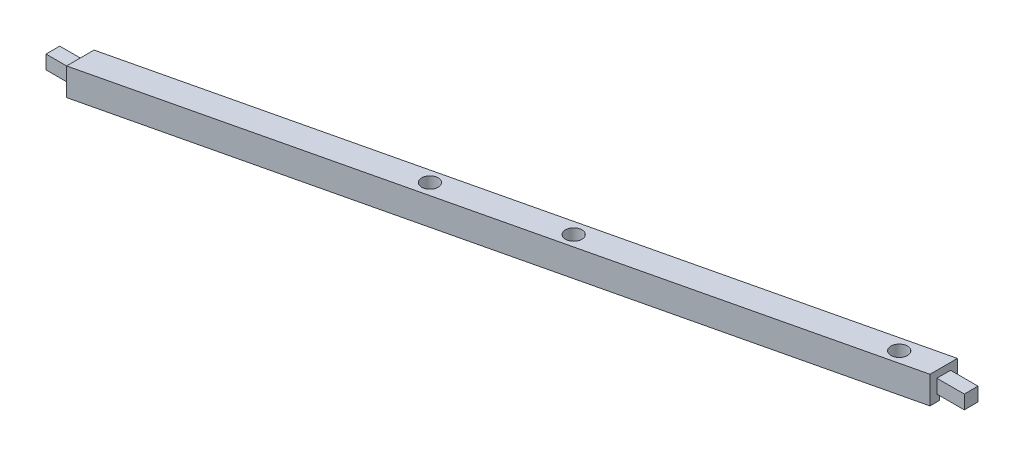
ISO-10303-21;
HEADER;
FILE_DESCRIPTION(('STEP AP214'),'2;1');
FILE_NAME('part.step','',(''),(''),'','','');
FILE_SCHEMA(('AUTOMOTIVE_DESIGN { 1 0 10303 214 1 1 1 1 }'));
ENDSEC;
DATA;
#1=APPLICATION_CONTEXT('core data for automotive mechanical design processes');
#2=APPLICATION_PROTOCOL_DEFINITION('international standard','automotive_design',2000,#1);
#3=PRODUCT_CONTEXT('',#1,'mechanical');
#4=PRODUCT('Part','Part','',(#3));
#5=PRODUCT_RELATED_PRODUCT_CATEGORY('part','',(#4));
#6=PRODUCT_DEFINITION_FORMATION('','',#4);
#7=PRODUCT_DEFINITION_CONTEXT('part definition',#1,'design');
#8=PRODUCT_DEFINITION('design','',#6,#7);
#9=PRODUCT_DEFINITION_SHAPE('','',#8);
#10=(LENGTH_UNIT() NAMED_UNIT(*) SI_UNIT(.MILLI.,.METRE.));
#11=(NAMED_UNIT(*) PLANE_ANGLE_UNIT() SI_UNIT($,.RADIAN.));
#12=(NAMED_UNIT(*) SI_UNIT($,.STERADIAN.) SOLID_ANGLE_UNIT());
#13=UNCERTAINTY_MEASURE_WITH_UNIT(LENGTH_MEASURE(1.E-05),#10,'distance_accuracy_value','');
#14=(GEOMETRIC_REPRESENTATION_CONTEXT(3) GLOBAL_UNCERTAINTY_ASSIGNED_CONTEXT((#13)) GLOBAL_UNIT_ASSIGNED_CONTEXT((#10,
#11,#12)) REPRESENTATION_CONTEXT('',''));
#15=CARTESIAN_POINT('',(0.,0.,0.));
#16=DIRECTION('',(0.,0.,1.));
#17=DIRECTION('',(1.,0.,0.));
#18=AXIS2_PLACEMENT_3D('',#15,#16,#17);
#19=CARTESIAN_POINT('',(0.,0.,0.));
#20=DIRECTION('',(0.,1.,0.));
#21=DIRECTION('',(0.,0.,1.));
#22=AXIS2_PLACEMENT_3D('',#19,#20,#21);
#23=PLANE('',#22);
#24=DIRECTION('',(0.,0.,-1.));
#25=VECTOR('',#24,1.);
#26=CARTESIAN_POINT('',(0.,0.,0.));
#27=LINE('',#26,#25);
#28=CARTESIAN_POINT('',(0.,0.,0.));
#29=VERTEX_POINT('',#28);
#30=CARTESIAN_POINT('',(0.,0.,-1.75));
#31=VERTEX_POINT('',#30);
#32=EDGE_CURVE('E425',#29,#31,#27,.T.);
#33=ORIENTED_EDGE('',*,*,#32,.T.);
#34=DIRECTION('',(-0.973336888209918,0.,0.22938025645167));
#35=VECTOR('',#34,1.);
#36=CARTESIAN_POINT('',(0.,0.,-1.75));
#37=LINE('',#36,#35);
#38=CARTESIAN_POINT('',(50.4456686779814,0.,-13.6382172846775));
#39=VERTEX_POINT('',#38);
#40=EDGE_CURVE('E265',#39,#31,#37,.T.);
#41=ORIENTED_EDGE('',*,*,#40,.F.);
#42=CARTESIAN_POINT('',(51.5,0.,-14.7051687659598));
#43=DIRECTION('',(0.,-1.,0.));
#44=DIRECTION('',(0.,0.,-1.));
#45=AXIS2_PLACEMENT_3D('',#42,#43,#44);
#46=CIRCLE('',#45,1.5);
#47=CARTESIAN_POINT('',(52.9198076766668,0.,-14.2212822490181));
#48=VERTEX_POINT('',#47);
#49=EDGE_CURVE('E320',#48,#39,#46,.T.);
#50=ORIENTED_EDGE('',*,*,#49,.F.);
#51=CARTESIAN_POINT('',(71.6426769276183,0.,-18.6335845076869));
#52=VERTEX_POINT('',#51);
#53=EDGE_CURVE('E467',#52,#48,#37,.T.);
#54=ORIENTED_EDGE('',*,*,#53,.F.);
#55=CARTESIAN_POINT('',(72.8,0.,-19.5878398750457));
#56=DIRECTION('',(0.,-1.,0.));
#57=DIRECTION('',(0.,0.,-1.));
#58=AXIS2_PLACEMENT_3D('',#55,#56,#57);
#59=CIRCLE('',#58,1.5);
#60=CARTESIAN_POINT('',(74.2616395128278,0.,-19.250779146778));
#61=VERTEX_POINT('',#60);
#62=EDGE_CURVE('E327',#61,#52,#59,.T.);
#63=ORIENTED_EDGE('',*,*,#62,.F.);
#64=CARTESIAN_POINT('',(119.642676927618,0.,-29.945446251599));
#65=VERTEX_POINT('',#64);
#66=EDGE_CURVE('E263',#65,#61,#37,.T.);
#67=ORIENTED_EDGE('',*,*,#66,.F.);
#68=CARTESIAN_POINT('',(120.8,0.,-30.8997016189577));
#69=DIRECTION('',(0.,-1.,0.));
#70=DIRECTION('',(0.,0.,-1.));
#71=AXIS2_PLACEMENT_3D('',#68,#69,#70);
#72=CIRCLE('',#71,1.5);
#73=CARTESIAN_POINT('',(122.261639512828,0.,-30.56264089069));
#74=VERTEX_POINT('',#73);
#75=EDGE_CURVE('E334',#74,#65,#72,.T.);
#76=ORIENTED_EDGE('',*,*,#75,.F.);
#77=CARTESIAN_POINT('',(127.3,0.,-31.75));
#78=VERTEX_POINT('',#77);
#79=EDGE_CURVE('E260',#78,#74,#37,.T.);
#80=ORIENTED_EDGE('',*,*,#79,.F.);
#81=DIRECTION('',(0.,0.,-1.));
#82=VECTOR('',#81,1.);
#83=CARTESIAN_POINT('',(127.3,0.,0.));
#84=LINE('',#83,#82);
#85=CARTESIAN_POINT('',(127.3,0.,-30.));
#86=VERTEX_POINT('',#85);
#87=EDGE_CURVE('E418',#86,#78,#84,.T.);
#88=ORIENTED_EDGE('',*,*,#87,.F.);
#89=DIRECTION('',(0.973336888209918,0.,-0.22938025645167));
#90=VECTOR('',#89,1.);
#91=CARTESIAN_POINT('',(0.,0.,0.));
#92=LINE('',#91,#90);
#93=EDGE_CURVE('E410',#29,#86,#92,.T.);
#94=ORIENTED_EDGE('',*,*,#93,.F.);
#95=EDGE_LOOP('',(#33,#41,#50,#54,#63,#67,#76,#80,#88,#94));
#96=FACE_BOUND('',#95,.T.);
#97=ADVANCED_FACE('F35',(#96),#23,.F.);
#98=CARTESIAN_POINT('',(127.3,5.,0.));
#99=DIRECTION('',(-1.,0.,0.));
#100=DIRECTION('',(0.,0.,1.));
#101=AXIS2_PLACEMENT_3D('',#98,#99,#100);
#102=PLANE('',#101);
#103=ORIENTED_EDGE('',*,*,#87,.T.);
#104=DIRECTION('',(0.,-1.,0.));
#105=VECTOR('',#104,1.);
#106=CARTESIAN_POINT('',(127.3,2.,-31.75));
#107=LINE('',#106,#105);
#108=CARTESIAN_POINT('',(127.3,1.25,-31.75));
#109=VERTEX_POINT('',#108);
#110=EDGE_CURVE('E280',#109,#78,#107,.T.);
#111=ORIENTED_EDGE('',*,*,#110,.F.);
#112=DIRECTION('',(0.,0.,-1.));
#113=VECTOR('',#112,1.);
#114=CARTESIAN_POINT('',(127.3,1.25,-31.25));
#115=LINE('',#114,#113);
#116=CARTESIAN_POINT('',(127.3,1.25,-31.25));
#117=VERTEX_POINT('',#116);
#118=EDGE_CURVE('E385',#117,#109,#115,.T.);
#119=ORIENTED_EDGE('',*,*,#118,.F.);
#120=DIRECTION('',(0.,-1.,0.));
#121=VECTOR('',#120,1.);
#122=CARTESIAN_POINT('',(127.3,3.75,-31.25));
#123=LINE('',#122,#121);
#124=CARTESIAN_POINT('',(127.3,3.75,-31.25));
#125=VERTEX_POINT('',#124);
#126=EDGE_CURVE('E370',#125,#117,#123,.T.);
#127=ORIENTED_EDGE('',*,*,#126,.F.);
#128=DIRECTION('',(0.,0.,1.));
#129=VECTOR('',#128,1.);
#130=CARTESIAN_POINT('',(127.3,3.75,-31.25));
#131=LINE('',#130,#129);
#132=CARTESIAN_POINT('',(127.3,3.75,-33.75));
#133=VERTEX_POINT('',#132);
#134=EDGE_CURVE('E375',#133,#125,#131,.T.);
#135=ORIENTED_EDGE('',*,*,#134,.F.);
#136=DIRECTION('',(0.,1.,0.));
#137=VECTOR('',#136,1.);
#138=CARTESIAN_POINT('',(127.3,3.75,-33.75));
#139=LINE('',#138,#137);
#140=CARTESIAN_POINT('',(127.3,1.25,-33.75));
#141=VERTEX_POINT('',#140);
#142=EDGE_CURVE('E388',#141,#133,#139,.T.);
#143=ORIENTED_EDGE('',*,*,#142,.F.);
#144=CARTESIAN_POINT('',(127.3,1.25,-33.25));
#145=VERTEX_POINT('',#144);
#146=EDGE_CURVE('E384',#145,#141,#115,.T.);
#147=ORIENTED_EDGE('',*,*,#146,.F.);
#148=DIRECTION('',(0.,-1.,0.));
#149=VECTOR('',#148,1.);
#150=CARTESIAN_POINT('',(127.3,2.,-33.25));
#151=LINE('',#150,#149);
#152=CARTESIAN_POINT('',(127.3,0.,-33.25));
#153=VERTEX_POINT('',#152);
#154=EDGE_CURVE('E243',#145,#153,#151,.T.);
#155=ORIENTED_EDGE('',*,*,#154,.T.);
#156=CARTESIAN_POINT('',(127.3,0.,-35.));
#157=VERTEX_POINT('',#156);
#158=EDGE_CURVE('E405',#153,#157,#84,.T.);
#159=ORIENTED_EDGE('',*,*,#158,.T.);
#160=DIRECTION('',(0.,-1.,0.));
#161=VECTOR('',#160,1.);
#162=CARTESIAN_POINT('',(127.3,5.,-35.));
#163=LINE('',#162,#161);
#164=CARTESIAN_POINT('',(127.3,5.,-35.));
#165=VERTEX_POINT('',#164);
#166=EDGE_CURVE('E436',#165,#157,#163,.T.);
#167=ORIENTED_EDGE('',*,*,#166,.F.);
#168=DIRECTION('',(0.,0.,-1.));
#169=VECTOR('',#168,1.);
#170=CARTESIAN_POINT('',(127.3,5.,0.));
#171=LINE('',#170,#169);
#172=CARTESIAN_POINT('',(127.3,5.,-30.));
#173=VERTEX_POINT('',#172);
#174=EDGE_CURVE('E406',#173,#165,#171,.T.);
#175=ORIENTED_EDGE('',*,*,#174,.F.);
#176=DIRECTION('',(0.,-1.,0.));
#177=VECTOR('',#176,1.);
#178=CARTESIAN_POINT('',(127.3,5.,-30.));
#179=LINE('',#178,#177);
#180=EDGE_CURVE('E417',#173,#86,#179,.T.);
#181=ORIENTED_EDGE('',*,*,#180,.T.);
#182=EDGE_LOOP('',(#103,#111,#119,#127,#135,#143,#147,#155,#159,#167,#175,#181));
#183=FACE_BOUND('',#182,.T.);
#184=ADVANCED_FACE('F37',(#183),#102,.F.);
#185=CARTESIAN_POINT('',(-1.11632132515731,5.,-4.73692348975083));
#186=DIRECTION('',(0.22938025645167,0.,0.973336888209918));
#187=DIRECTION('',(0.973336888209918,0.,-0.22938025645167));
#188=AXIS2_PLACEMENT_3D('',#185,#186,#187);
#189=PLANE('',#188);
#190=DIRECTION('',(-0.973336888209918,0.,0.22938025645167));
#191=VECTOR('',#190,1.);
#192=CARTESIAN_POINT('',(-1.11632132515731,0.,-4.73692348975083));
#193=LINE('',#192,#191);
#194=CARTESIAN_POINT('',(0.,0.,-5.));
#195=VERTEX_POINT('',#194);
#196=EDGE_CURVE('E421',#157,#195,#193,.T.);
#197=ORIENTED_EDGE('',*,*,#196,.T.);
#198=DIRECTION('',(0.,-1.,0.));
#199=VECTOR('',#198,1.);
#200=CARTESIAN_POINT('',(0.,5.,-5.));
#201=LINE('',#200,#199);
#202=CARTESIAN_POINT('',(0.,5.,-5.));
#203=VERTEX_POINT('',#202);
#204=EDGE_CURVE('E433',#203,#195,#201,.T.);
#205=ORIENTED_EDGE('',*,*,#204,.F.);
#206=DIRECTION('',(-0.973336888209918,0.,0.22938025645167));
#207=VECTOR('',#206,1.);
#208=CARTESIAN_POINT('',(-1.11632132515731,5.,-4.73692348975083));
#209=LINE('',#208,#207);
#210=EDGE_CURVE('E409',#165,#203,#209,.T.);
#211=ORIENTED_EDGE('',*,*,#210,.F.);
#212=ORIENTED_EDGE('',*,*,#166,.T.);
#213=EDGE_LOOP('',(#197,#205,#211,#212));
#214=FACE_BOUND('',#213,.T.);
#215=ADVANCED_FACE('F496',(#214),#189,.F.);
#216=CARTESIAN_POINT('',(0.,5.,0.));
#217=DIRECTION('',(-1.,0.,0.));
#218=DIRECTION('',(0.,0.,1.));
#219=AXIS2_PLACEMENT_3D('',#216,#217,#218);
#220=PLANE('',#219);
#221=DIRECTION('',(0.,-1.,0.));
#222=VECTOR('',#221,1.);
#223=CARTESIAN_POINT('',(0.,2.,-1.75));
#224=LINE('',#223,#222);
#225=CARTESIAN_POINT('',(0.,1.25,-1.75));
#226=VERTEX_POINT('',#225);
#227=EDGE_CURVE('E276',#226,#31,#224,.T.);
#228=ORIENTED_EDGE('',*,*,#227,.T.);
#229=ORIENTED_EDGE('',*,*,#32,.F.);
#230=DIRECTION('',(0.,-1.,0.));
#231=VECTOR('',#230,1.);
#232=CARTESIAN_POINT('',(0.,5.,0.));
#233=LINE('',#232,#231);
#234=CARTESIAN_POINT('',(0.,5.,0.));
#235=VERTEX_POINT('',#234);
#236=EDGE_CURVE('E431',#235,#29,#233,.T.);
#237=ORIENTED_EDGE('',*,*,#236,.F.);
#238=DIRECTION('',(0.,0.,-1.));
#239=VECTOR('',#238,1.);
#240=CARTESIAN_POINT('',(0.,5.,0.));
#241=LINE('',#240,#239);
#242=EDGE_CURVE('E412',#235,#203,#241,.T.);
#243=ORIENTED_EDGE('',*,*,#242,.T.);
#244=ORIENTED_EDGE('',*,*,#204,.T.);
#245=CARTESIAN_POINT('',(0.,0.,-3.25));
#246=VERTEX_POINT('',#245);
#247=EDGE_CURVE('E424',#246,#195,#27,.T.);
#248=ORIENTED_EDGE('',*,*,#247,.F.);
#249=DIRECTION('',(0.,-1.,0.));
#250=VECTOR('',#249,1.);
#251=CARTESIAN_POINT('',(0.,2.,-3.25));
#252=LINE('',#251,#250);
#253=CARTESIAN_POINT('',(0.,1.25,-3.25));
#254=VERTEX_POINT('',#253);
#255=EDGE_CURVE('E244',#254,#246,#252,.T.);
#256=ORIENTED_EDGE('',*,*,#255,.F.);
#257=DIRECTION('',(0.,0.,1.));
#258=VECTOR('',#257,1.);
#259=CARTESIAN_POINT('',(0.,1.25,-3.75));
#260=LINE('',#259,#258);
#261=CARTESIAN_POINT('',(0.,1.25,-3.75));
#262=VERTEX_POINT('',#261);
#263=EDGE_CURVE('E351',#262,#254,#260,.T.);
#264=ORIENTED_EDGE('',*,*,#263,.F.);
#265=DIRECTION('',(0.,-1.,0.));
#266=VECTOR('',#265,1.);
#267=CARTESIAN_POINT('',(0.,3.75,-3.75));
#268=LINE('',#267,#266);
#269=CARTESIAN_POINT('',(0.,3.75,-3.75));
#270=VERTEX_POINT('',#269);
#271=EDGE_CURVE('E319',#270,#262,#268,.T.);
#272=ORIENTED_EDGE('',*,*,#271,.F.);
#273=DIRECTION('',(0.,0.,-1.));
#274=VECTOR('',#273,1.);
#275=CARTESIAN_POINT('',(0.,3.75,-3.75));
#276=LINE('',#275,#274);
#277=CARTESIAN_POINT('',(0.,3.75,-1.25));
#278=VERTEX_POINT('',#277);
#279=EDGE_CURVE('E341',#278,#270,#276,.T.);
#280=ORIENTED_EDGE('',*,*,#279,.F.);
#281=DIRECTION('',(0.,1.,0.));
#282=VECTOR('',#281,1.);
#283=CARTESIAN_POINT('',(0.,3.75,-1.25));
#284=LINE('',#283,#282);
#285=CARTESIAN_POINT('',(0.,1.25,-1.25));
#286=VERTEX_POINT('',#285);
#287=EDGE_CURVE('E354',#286,#278,#284,.T.);
#288=ORIENTED_EDGE('',*,*,#287,.F.);
#289=EDGE_CURVE('E350',#226,#286,#260,.T.);
#290=ORIENTED_EDGE('',*,*,#289,.F.);
#291=EDGE_LOOP('',(#228,#229,#237,#243,#244,#248,#256,#264,#272,#280,#288,#290));
#292=FACE_BOUND('',#291,.T.);
#293=ADVANCED_FACE('F512',(#292),#220,.T.);
#294=CARTESIAN_POINT('',(0.,5.,0.));
#295=DIRECTION('',(-0.22938025645167,0.,-0.973336888209918));
#296=DIRECTION('',(-0.973336888209918,0.,0.22938025645167));
#297=AXIS2_PLACEMENT_3D('',#294,#295,#296);
#298=PLANE('',#297);
#299=ORIENTED_EDGE('',*,*,#93,.T.);
#300=ORIENTED_EDGE('',*,*,#180,.F.);
#301=DIRECTION('',(0.973336888209918,0.,-0.22938025645167));
#302=VECTOR('',#301,1.);
#303=CARTESIAN_POINT('',(0.,5.,0.));
#304=LINE('',#303,#302);
#305=EDGE_CURVE('E415',#235,#173,#304,.T.);
#306=ORIENTED_EDGE('',*,*,#305,.F.);
#307=ORIENTED_EDGE('',*,*,#236,.T.);
#308=EDGE_LOOP('',(#299,#300,#306,#307));
#309=FACE_BOUND('',#308,.T.);
#310=ADVANCED_FACE('F505',(#309),#298,.F.);
#311=CARTESIAN_POINT('',(0.,5.,0.));
#312=DIRECTION('',(0.,1.,0.));
#313=DIRECTION('',(0.,0.,1.));
#314=AXIS2_PLACEMENT_3D('',#311,#312,#313);
#315=PLANE('',#314);
#316=CARTESIAN_POINT('',(51.5,5.,-14.7051687659598));
#317=DIRECTION('',(0.,-1.,0.));
#318=DIRECTION('',(0.,0.,-1.));
#319=AXIS2_PLACEMENT_3D('',#316,#317,#318);
#320=CIRCLE('',#319,1.5);
#321=CARTESIAN_POINT('',(51.5,5.,-16.2051687659598));
#322=VERTEX_POINT('',#321);
#323=EDGE_CURVE('E316',#322,#322,#320,.T.);
#324=ORIENTED_EDGE('',*,*,#323,.T.);
#325=EDGE_LOOP('',(#324));
#326=FACE_BOUND('',#325,.T.);
#327=CARTESIAN_POINT('',(72.8,5.,-19.5878398750457));
#328=DIRECTION('',(0.,-1.,0.));
#329=DIRECTION('',(0.,0.,-1.));
#330=AXIS2_PLACEMENT_3D('',#327,#328,#329);
#331=CIRCLE('',#330,1.5);
#332=CARTESIAN_POINT('',(72.8,5.,-21.0878398750457));
#333=VERTEX_POINT('',#332);
#334=EDGE_CURVE('E324',#333,#333,#331,.T.);
#335=ORIENTED_EDGE('',*,*,#334,.T.);
#336=EDGE_LOOP('',(#335));
#337=FACE_BOUND('',#336,.T.);
#338=CARTESIAN_POINT('',(120.8,5.,-30.8997016189577));
#339=DIRECTION('',(0.,-1.,0.));
#340=DIRECTION('',(0.,0.,-1.));
#341=AXIS2_PLACEMENT_3D('',#338,#339,#340);
#342=CIRCLE('',#341,1.5);
#343=CARTESIAN_POINT('',(120.8,5.,-32.3997016189577));
#344=VERTEX_POINT('',#343);
#345=EDGE_CURVE('E331',#344,#344,#342,.T.);
#346=ORIENTED_EDGE('',*,*,#345,.T.);
#347=EDGE_LOOP('',(#346));
#348=FACE_BOUND('',#347,.T.);
#349=ORIENTED_EDGE('',*,*,#174,.T.);
#350=ORIENTED_EDGE('',*,*,#210,.T.);
#351=ORIENTED_EDGE('',*,*,#242,.F.);
#352=ORIENTED_EDGE('',*,*,#305,.T.);
#353=EDGE_LOOP('',(#349,#350,#351,#352));
#354=FACE_BOUND('',#353,.T.);
#355=ADVANCED_FACE('F501',(#326,#337,#348,#354),#315,.T.);
#356=ORIENTED_EDGE('',*,*,#158,.F.);
#357=DIRECTION('',(0.973336888209918,0.,-0.22938025645167));
#358=VECTOR('',#357,1.);
#359=CARTESIAN_POINT('',(0.,0.,-3.25));
#360=LINE('',#359,#358);
#361=CARTESIAN_POINT('',(121.854331322019,0.,-31.96665310024));
#362=VERTEX_POINT('',#361);
#363=EDGE_CURVE('E271',#362,#153,#360,.T.);
#364=ORIENTED_EDGE('',*,*,#363,.F.);
#365=CARTESIAN_POINT('',(119.380192323333,0.,-31.3835881358994));
#366=VERTEX_POINT('',#365);
#367=EDGE_CURVE('E315',#366,#362,#72,.T.);
#368=ORIENTED_EDGE('',*,*,#367,.F.);
#369=CARTESIAN_POINT('',(73.8543313220186,0.,-20.654791356328));
#370=VERTEX_POINT('',#369);
#371=EDGE_CURVE('E478',#370,#366,#360,.T.);
#372=ORIENTED_EDGE('',*,*,#371,.F.);
#373=CARTESIAN_POINT('',(71.3801923233332,0.,-20.0717263919874));
#374=VERTEX_POINT('',#373);
#375=EDGE_CURVE('E328',#374,#370,#59,.T.);
#376=ORIENTED_EDGE('',*,*,#375,.F.);
#377=CARTESIAN_POINT('',(52.6573230723817,0.,-15.6594241333185));
#378=VERTEX_POINT('',#377);
#379=EDGE_CURVE('E270',#378,#374,#360,.T.);
#380=ORIENTED_EDGE('',*,*,#379,.F.);
#381=CARTESIAN_POINT('',(50.0383604871721,0.,-15.0422294942275));
#382=VERTEX_POINT('',#381);
#383=EDGE_CURVE('E321',#382,#378,#46,.T.);
#384=ORIENTED_EDGE('',*,*,#383,.F.);
#385=EDGE_CURVE('E269',#246,#382,#360,.T.);
#386=ORIENTED_EDGE('',*,*,#385,.F.);
#387=ORIENTED_EDGE('',*,*,#247,.T.);
#388=ORIENTED_EDGE('',*,*,#196,.F.);
#389=EDGE_LOOP('',(#356,#364,#368,#372,#376,#380,#384,#386,#387,#388));
#390=FACE_BOUND('',#389,.T.);
#391=ADVANCED_FACE('F475',(#390),#23,.F.);
#392=CARTESIAN_POINT('',(132.3,3.75,-31.25));
#393=DIRECTION('',(0.,0.,-1.));
#394=DIRECTION('',(-1.,0.,0.));
#395=AXIS2_PLACEMENT_3D('',#392,#393,#394);
#396=PLANE('',#395);
#397=ORIENTED_EDGE('',*,*,#126,.T.);
#398=DIRECTION('',(-1.,0.,0.));
#399=VECTOR('',#398,1.);
#400=CARTESIAN_POINT('',(132.3,1.25,-31.25));
#401=LINE('',#400,#399);
#402=CARTESIAN_POINT('',(132.3,1.25,-31.25));
#403=VERTEX_POINT('',#402);
#404=EDGE_CURVE('E402',#403,#117,#401,.T.);
#405=ORIENTED_EDGE('',*,*,#404,.F.);
#406=DIRECTION('',(0.,-1.,0.));
#407=VECTOR('',#406,1.);
#408=CARTESIAN_POINT('',(132.3,3.75,-31.25));
#409=LINE('',#408,#407);
#410=CARTESIAN_POINT('',(132.3,3.75,-31.25));
#411=VERTEX_POINT('',#410);
#412=EDGE_CURVE('E371',#411,#403,#409,.T.);
#413=ORIENTED_EDGE('',*,*,#412,.F.);
#414=DIRECTION('',(-1.,0.,0.));
#415=VECTOR('',#414,1.);
#416=CARTESIAN_POINT('',(132.3,3.75,-31.25));
#417=LINE('',#416,#415);
#418=EDGE_CURVE('E381',#411,#125,#417,.T.);
#419=ORIENTED_EDGE('',*,*,#418,.T.);
#420=EDGE_LOOP('',(#397,#405,#413,#419));
#421=FACE_BOUND('',#420,.T.);
#422=ADVANCED_FACE('F541',(#421),#396,.F.);
#423=CARTESIAN_POINT('',(132.3,1.25,-31.25));
#424=DIRECTION('',(0.,1.,0.));
#425=DIRECTION('',(0.,0.,1.));
#426=AXIS2_PLACEMENT_3D('',#423,#424,#425);
#427=PLANE('',#426);
#428=ORIENTED_EDGE('',*,*,#118,.T.);
#429=EDGE_CURVE('E389',#109,#145,#115,.T.);
#430=ORIENTED_EDGE('',*,*,#429,.T.);
#431=ORIENTED_EDGE('',*,*,#146,.T.);
#432=DIRECTION('',(-1.,0.,0.));
#433=VECTOR('',#432,1.);
#434=CARTESIAN_POINT('',(132.3,1.25,-33.75));
#435=LINE('',#434,#433);
#436=CARTESIAN_POINT('',(132.3,1.25,-33.75));
#437=VERTEX_POINT('',#436);
#438=EDGE_CURVE('E399',#437,#141,#435,.T.);
#439=ORIENTED_EDGE('',*,*,#438,.F.);
#440=DIRECTION('',(0.,0.,-1.));
#441=VECTOR('',#440,1.);
#442=CARTESIAN_POINT('',(132.3,1.25,-31.25));
#443=LINE('',#442,#441);
#444=EDGE_CURVE('E374',#403,#437,#443,.T.);
#445=ORIENTED_EDGE('',*,*,#444,.F.);
#446=ORIENTED_EDGE('',*,*,#404,.T.);
#447=EDGE_LOOP('',(#428,#430,#431,#439,#445,#446));
#448=FACE_BOUND('',#447,.T.);
#449=ADVANCED_FACE('F536',(#448),#427,.F.);
#450=CARTESIAN_POINT('',(132.3,3.75,-33.75));
#451=DIRECTION('',(0.,0.,1.));
#452=DIRECTION('',(1.,0.,0.));
#453=AXIS2_PLACEMENT_3D('',#450,#451,#452);
#454=PLANE('',#453);
#455=ORIENTED_EDGE('',*,*,#142,.T.);
#456=DIRECTION('',(-1.,0.,0.));
#457=VECTOR('',#456,1.);
#458=CARTESIAN_POINT('',(132.3,3.75,-33.75));
#459=LINE('',#458,#457);
#460=CARTESIAN_POINT('',(132.3,3.75,-33.75));
#461=VERTEX_POINT('',#460);
#462=EDGE_CURVE('E396',#461,#133,#459,.T.);
#463=ORIENTED_EDGE('',*,*,#462,.F.);
#464=DIRECTION('',(0.,1.,0.));
#465=VECTOR('',#464,1.);
#466=CARTESIAN_POINT('',(132.3,3.75,-33.75));
#467=LINE('',#466,#465);
#468=EDGE_CURVE('E377',#437,#461,#467,.T.);
#469=ORIENTED_EDGE('',*,*,#468,.F.);
#470=ORIENTED_EDGE('',*,*,#438,.T.);
#471=EDGE_LOOP('',(#455,#463,#469,#470));
#472=FACE_BOUND('',#471,.T.);
#473=ADVANCED_FACE('F549',(#472),#454,.F.);
#474=CARTESIAN_POINT('',(132.3,3.75,-31.25));
#475=DIRECTION('',(0.,-1.,0.));
#476=DIRECTION('',(0.,0.,-1.));
#477=AXIS2_PLACEMENT_3D('',#474,#475,#476);
#478=PLANE('',#477);
#479=ORIENTED_EDGE('',*,*,#134,.T.);
#480=ORIENTED_EDGE('',*,*,#418,.F.);
#481=DIRECTION('',(0.,0.,1.));
#482=VECTOR('',#481,1.);
#483=CARTESIAN_POINT('',(132.3,3.75,-31.25));
#484=LINE('',#483,#482);
#485=EDGE_CURVE('E379',#461,#411,#484,.T.);
#486=ORIENTED_EDGE('',*,*,#485,.F.);
#487=ORIENTED_EDGE('',*,*,#462,.T.);
#488=EDGE_LOOP('',(#479,#480,#486,#487));
#489=FACE_BOUND('',#488,.T.);
#490=ADVANCED_FACE('F544',(#489),#478,.F.);
#491=CARTESIAN_POINT('',(132.3,0.,0.));
#492=DIRECTION('',(1.,0.,0.));
#493=DIRECTION('',(0.,0.,-1.));
#494=AXIS2_PLACEMENT_3D('',#491,#492,#493);
#495=PLANE('',#494);
#496=ORIENTED_EDGE('',*,*,#412,.T.);
#497=ORIENTED_EDGE('',*,*,#444,.T.);
#498=ORIENTED_EDGE('',*,*,#468,.T.);
#499=ORIENTED_EDGE('',*,*,#485,.T.);
#500=EDGE_LOOP('',(#496,#497,#498,#499));
#501=FACE_BOUND('',#500,.T.);
#502=ADVANCED_FACE('F551',(#501),#495,.T.);
#503=CARTESIAN_POINT('',(-5.,3.75,-3.75));
#504=DIRECTION('',(0.,0.,1.));
#505=DIRECTION('',(0.,-1.,0.));
#506=AXIS2_PLACEMENT_3D('',#503,#504,#505);
#507=PLANE('',#506);
#508=ORIENTED_EDGE('',*,*,#271,.T.);
#509=DIRECTION('',(1.,0.,0.));
#510=VECTOR('',#509,1.);
#511=CARTESIAN_POINT('',(-5.,1.25,-3.75));
#512=LINE('',#511,#510);
#513=CARTESIAN_POINT('',(-5.,1.25,-3.75));
#514=VERTEX_POINT('',#513);
#515=EDGE_CURVE('E367',#514,#262,#512,.T.);
#516=ORIENTED_EDGE('',*,*,#515,.F.);
#517=DIRECTION('',(0.,-1.,0.));
#518=VECTOR('',#517,1.);
#519=CARTESIAN_POINT('',(-5.,3.75,-3.75));
#520=LINE('',#519,#518);
#521=CARTESIAN_POINT('',(-5.,3.75,-3.75));
#522=VERTEX_POINT('',#521);
#523=EDGE_CURVE('E337',#522,#514,#520,.T.);
#524=ORIENTED_EDGE('',*,*,#523,.F.);
#525=DIRECTION('',(1.,0.,0.));
#526=VECTOR('',#525,1.);
#527=CARTESIAN_POINT('',(-5.,3.75,-3.75));
#528=LINE('',#527,#526);
#529=EDGE_CURVE('E347',#522,#270,#528,.T.);
#530=ORIENTED_EDGE('',*,*,#529,.T.);
#531=EDGE_LOOP('',(#508,#516,#524,#530));
#532=FACE_BOUND('',#531,.T.);
#533=ADVANCED_FACE('F553',(#532),#507,.F.);
#534=CARTESIAN_POINT('',(-5.,1.25,-3.75));
#535=DIRECTION('',(0.,1.,0.));
#536=DIRECTION('',(0.,0.,1.));
#537=AXIS2_PLACEMENT_3D('',#534,#535,#536);
#538=PLANE('',#537);
#539=ORIENTED_EDGE('',*,*,#263,.T.);
#540=EDGE_CURVE('E240',#254,#226,#260,.T.);
#541=ORIENTED_EDGE('',*,*,#540,.T.);
#542=ORIENTED_EDGE('',*,*,#289,.T.);
#543=DIRECTION('',(1.,0.,0.));
#544=VECTOR('',#543,1.);
#545=CARTESIAN_POINT('',(-5.,1.25,-1.25));
#546=LINE('',#545,#544);
#547=CARTESIAN_POINT('',(-5.,1.25,-1.25));
#548=VERTEX_POINT('',#547);
#549=EDGE_CURVE('E364',#548,#286,#546,.T.);
#550=ORIENTED_EDGE('',*,*,#549,.F.);
#551=DIRECTION('',(0.,0.,1.));
#552=VECTOR('',#551,1.);
#553=CARTESIAN_POINT('',(-5.,1.25,-3.75));
#554=LINE('',#553,#552);
#555=EDGE_CURVE('E340',#514,#548,#554,.T.);
#556=ORIENTED_EDGE('',*,*,#555,.F.);
#557=ORIENTED_EDGE('',*,*,#515,.T.);
#558=EDGE_LOOP('',(#539,#541,#542,#550,#556,#557));
#559=FACE_BOUND('',#558,.T.);
#560=ADVANCED_FACE('F559',(#559),#538,.F.);
#561=CARTESIAN_POINT('',(-5.,3.75,-1.25));
#562=DIRECTION('',(0.,0.,-1.));
#563=DIRECTION('',(0.,1.,0.));
#564=AXIS2_PLACEMENT_3D('',#561,#562,#563);
#565=PLANE('',#564);
#566=ORIENTED_EDGE('',*,*,#287,.T.);
#567=DIRECTION('',(1.,0.,0.));
#568=VECTOR('',#567,1.);
#569=CARTESIAN_POINT('',(-5.,3.75,-1.25));
#570=LINE('',#569,#568);
#571=CARTESIAN_POINT('',(-5.,3.75,-1.25));
#572=VERTEX_POINT('',#571);
#573=EDGE_CURVE('E361',#572,#278,#570,.T.);
#574=ORIENTED_EDGE('',*,*,#573,.F.);
#575=DIRECTION('',(0.,1.,0.));
#576=VECTOR('',#575,1.);
#577=CARTESIAN_POINT('',(-5.,3.75,-1.25));
#578=LINE('',#577,#576);
#579=EDGE_CURVE('E343',#548,#572,#578,.T.);
#580=ORIENTED_EDGE('',*,*,#579,.F.);
#581=ORIENTED_EDGE('',*,*,#549,.T.);
#582=EDGE_LOOP('',(#566,#574,#580,#581));
#583=FACE_BOUND('',#582,.T.);
#584=ADVANCED_FACE('F611',(#583),#565,.F.);
#585=CARTESIAN_POINT('',(-5.,3.75,-3.75));
#586=DIRECTION('',(0.,-1.,0.));
#587=DIRECTION('',(0.,0.,-1.));
#588=AXIS2_PLACEMENT_3D('',#585,#586,#587);
#589=PLANE('',#588);
#590=ORIENTED_EDGE('',*,*,#279,.T.);
#591=ORIENTED_EDGE('',*,*,#529,.F.);
#592=DIRECTION('',(0.,0.,-1.));
#593=VECTOR('',#592,1.);
#594=CARTESIAN_POINT('',(-5.,3.75,-3.75));
#595=LINE('',#594,#593);
#596=EDGE_CURVE('E345',#572,#522,#595,.T.);
#597=ORIENTED_EDGE('',*,*,#596,.F.);
#598=ORIENTED_EDGE('',*,*,#573,.T.);
#599=EDGE_LOOP('',(#590,#591,#597,#598));
#600=FACE_BOUND('',#599,.T.);
#601=ADVANCED_FACE('F616',(#600),#589,.F.);
#602=CARTESIAN_POINT('',(-5.,0.,0.));
#603=DIRECTION('',(-1.,0.,0.));
#604=DIRECTION('',(0.,0.,1.));
#605=AXIS2_PLACEMENT_3D('',#602,#603,#604);
#606=PLANE('',#605);
#607=ORIENTED_EDGE('',*,*,#523,.T.);
#608=ORIENTED_EDGE('',*,*,#555,.T.);
#609=ORIENTED_EDGE('',*,*,#579,.T.);
#610=ORIENTED_EDGE('',*,*,#596,.T.);
#611=EDGE_LOOP('',(#607,#608,#609,#610));
#612=FACE_BOUND('',#611,.T.);
#613=ADVANCED_FACE('F626',(#612),#606,.T.);
#614=CARTESIAN_POINT('',(120.8,5.,-30.8997016189577));
#615=DIRECTION('',(0.,-1.,0.));
#616=DIRECTION('',(0.,0.,-1.));
#617=AXIS2_PLACEMENT_3D('',#614,#615,#616);
#618=CYLINDRICAL_SURFACE('',#617,1.5);
#619=ORIENTED_EDGE('',*,*,#75,.T.);
#620=DIRECTION('',(0.,-1.,0.));
#621=VECTOR('',#620,1.);
#622=CARTESIAN_POINT('',(119.642676927618,5.,-29.945446251599));
#623=LINE('',#622,#621);
#624=CARTESIAN_POINT('',(119.642676927618,2.,-29.945446251599));
#625=VERTEX_POINT('',#624);
#626=EDGE_CURVE('E312',#65,#625,#623,.F.);
#627=ORIENTED_EDGE('',*,*,#626,.T.);
#628=CARTESIAN_POINT('',(120.8,2.,-30.8997016189577));
#629=DIRECTION('',(0.,1.,0.));
#630=DIRECTION('',(0.,0.,1.));
#631=AXIS2_PLACEMENT_3D('',#628,#629,#630);
#632=CIRCLE('',#631,1.5);
#633=CARTESIAN_POINT('',(119.380192323333,2.,-31.3835881358994));
#634=VERTEX_POINT('',#633);
#635=EDGE_CURVE('E290',#625,#634,#632,.F.);
#636=ORIENTED_EDGE('',*,*,#635,.T.);
#637=DIRECTION('',(0.,-1.,0.));
#638=VECTOR('',#637,1.);
#639=CARTESIAN_POINT('',(119.380192323333,5.,-31.3835881358994));
#640=LINE('',#639,#638);
#641=EDGE_CURVE('E297',#634,#366,#640,.T.);
#642=ORIENTED_EDGE('',*,*,#641,.T.);
#643=ORIENTED_EDGE('',*,*,#367,.T.);
#644=DIRECTION('',(0.,-1.,0.));
#645=VECTOR('',#644,1.);
#646=CARTESIAN_POINT('',(121.854331322019,5.,-31.96665310024));
#647=LINE('',#646,#645);
#648=CARTESIAN_POINT('',(121.854331322019,2.,-31.96665310024));
#649=VERTEX_POINT('',#648);
#650=EDGE_CURVE('E300',#362,#649,#647,.F.);
#651=ORIENTED_EDGE('',*,*,#650,.T.);
#652=CARTESIAN_POINT('',(122.261639512828,2.,-30.56264089069));
#653=VERTEX_POINT('',#652);
#654=EDGE_CURVE('E287',#649,#653,#632,.F.);
#655=ORIENTED_EDGE('',*,*,#654,.T.);
#656=DIRECTION('',(0.,-1.,0.));
#657=VECTOR('',#656,1.);
#658=CARTESIAN_POINT('',(122.261639512828,5.,-30.56264089069));
#659=LINE('',#658,#657);
#660=EDGE_CURVE('E309',#653,#74,#659,.T.);
#661=ORIENTED_EDGE('',*,*,#660,.T.);
#662=EDGE_LOOP('',(#619,#627,#636,#642,#643,#651,#655,#661));
#663=FACE_BOUND('',#662,.T.);
#664=ORIENTED_EDGE('',*,*,#345,.F.);
#665=EDGE_LOOP('',(#664));
#666=FACE_BOUND('',#665,.T.);
#667=ADVANCED_FACE('F531',(#663,#666),#618,.F.);
#668=CARTESIAN_POINT('',(72.8,5.,-19.5878398750457));
#669=DIRECTION('',(0.,-1.,0.));
#670=DIRECTION('',(0.,0.,-1.));
#671=AXIS2_PLACEMENT_3D('',#668,#669,#670);
#672=CYLINDRICAL_SURFACE('',#671,1.5);
#673=ORIENTED_EDGE('',*,*,#62,.T.);
#674=DIRECTION('',(0.,-1.,0.));
#675=VECTOR('',#674,1.);
#676=CARTESIAN_POINT('',(71.6426769276183,5.,-18.6335845076869));
#677=LINE('',#676,#675);
#678=CARTESIAN_POINT('',(71.6426769276183,2.,-18.6335845076869));
#679=VERTEX_POINT('',#678);
#680=EDGE_CURVE('E306',#52,#679,#677,.F.);
#681=ORIENTED_EDGE('',*,*,#680,.T.);
#682=CARTESIAN_POINT('',(72.8,2.,-19.5878398750457));
#683=DIRECTION('',(0.,1.,0.));
#684=DIRECTION('',(0.,0.,1.));
#685=AXIS2_PLACEMENT_3D('',#682,#683,#684);
#686=CIRCLE('',#685,1.5);
#687=CARTESIAN_POINT('',(71.3801923233332,2.,-20.0717263919874));
#688=VERTEX_POINT('',#687);
#689=EDGE_CURVE('E286',#679,#688,#686,.F.);
#690=ORIENTED_EDGE('',*,*,#689,.T.);
#691=DIRECTION('',(0.,-1.,0.));
#692=VECTOR('',#691,1.);
#693=CARTESIAN_POINT('',(71.3801923233332,5.,-20.0717263919874));
#694=LINE('',#693,#692);
#695=EDGE_CURVE('E291',#688,#374,#694,.T.);
#696=ORIENTED_EDGE('',*,*,#695,.T.);
#697=ORIENTED_EDGE('',*,*,#375,.T.);
#698=DIRECTION('',(0.,-1.,0.));
#699=VECTOR('',#698,1.);
#700=CARTESIAN_POINT('',(73.8543313220186,5.,-20.654791356328));
#701=LINE('',#700,#699);
#702=CARTESIAN_POINT('',(73.8543313220186,2.,-20.654791356328));
#703=VERTEX_POINT('',#702);
#704=EDGE_CURVE('E294',#370,#703,#701,.F.);
#705=ORIENTED_EDGE('',*,*,#704,.T.);
#706=CARTESIAN_POINT('',(74.2616395128278,2.,-19.250779146778));
#707=VERTEX_POINT('',#706);
#708=EDGE_CURVE('E275',#703,#707,#686,.F.);
#709=ORIENTED_EDGE('',*,*,#708,.T.);
#710=DIRECTION('',(0.,-1.,0.));
#711=VECTOR('',#710,1.);
#712=CARTESIAN_POINT('',(74.2616395128278,5.,-19.250779146778));
#713=LINE('',#712,#711);
#714=EDGE_CURVE('E303',#707,#61,#713,.T.);
#715=ORIENTED_EDGE('',*,*,#714,.T.);
#716=EDGE_LOOP('',(#673,#681,#690,#696,#697,#705,#709,#715));
#717=FACE_BOUND('',#716,.T.);
#718=ORIENTED_EDGE('',*,*,#334,.F.);
#719=EDGE_LOOP('',(#718));
#720=FACE_BOUND('',#719,.T.);
#721=ADVANCED_FACE('F523',(#717,#720),#672,.F.);
#722=CARTESIAN_POINT('',(51.5,5.,-14.7051687659598));
#723=DIRECTION('',(0.,-1.,0.));
#724=DIRECTION('',(0.,0.,-1.));
#725=AXIS2_PLACEMENT_3D('',#722,#723,#724);
#726=CYLINDRICAL_SURFACE('',#725,1.5);
#727=ORIENTED_EDGE('',*,*,#49,.T.);
#728=DIRECTION('',(0.,-1.,0.));
#729=VECTOR('',#728,1.);
#730=CARTESIAN_POINT('',(50.4456686779814,5.,-13.6382172846775));
#731=LINE('',#730,#729);
#732=CARTESIAN_POINT('',(50.4456686779814,2.,-13.6382172846775));
#733=VERTEX_POINT('',#732);
#734=EDGE_CURVE('E11',#39,#733,#731,.F.);
#735=ORIENTED_EDGE('',*,*,#734,.T.);
#736=CARTESIAN_POINT('',(51.5,2.,-14.7051687659598));
#737=DIRECTION('',(0.,1.,0.));
#738=DIRECTION('',(0.,0.,1.));
#739=AXIS2_PLACEMENT_3D('',#736,#737,#738);
#740=CIRCLE('',#739,1.5);
#741=CARTESIAN_POINT('',(50.0383604871721,2.,-15.0422294942275));
#742=VERTEX_POINT('',#741);
#743=EDGE_CURVE('E443',#733,#742,#740,.F.);
#744=ORIENTED_EDGE('',*,*,#743,.T.);
#745=DIRECTION('',(0.,-1.,0.));
#746=VECTOR('',#745,1.);
#747=CARTESIAN_POINT('',(50.0383604871721,5.,-15.0422294942275));
#748=LINE('',#747,#746);
#749=EDGE_CURVE('E43',#742,#382,#748,.T.);
#750=ORIENTED_EDGE('',*,*,#749,.T.);
#751=ORIENTED_EDGE('',*,*,#383,.T.);
#752=DIRECTION('',(0.,-1.,0.));
#753=VECTOR('',#752,1.);
#754=CARTESIAN_POINT('',(52.6573230723817,5.,-15.6594241333185));
#755=LINE('',#754,#753);
#756=CARTESIAN_POINT('',(52.6573230723817,2.,-15.6594241333185));
#757=VERTEX_POINT('',#756);
#758=EDGE_CURVE('E442',#378,#757,#755,.F.);
#759=ORIENTED_EDGE('',*,*,#758,.T.);
#760=CARTESIAN_POINT('',(52.9198076766668,2.,-14.2212822490181));
#761=VERTEX_POINT('',#760);
#762=EDGE_CURVE('E439',#757,#761,#740,.F.);
#763=ORIENTED_EDGE('',*,*,#762,.T.);
#764=DIRECTION('',(0.,-1.,0.));
#765=VECTOR('',#764,1.);
#766=CARTESIAN_POINT('',(52.9198076766668,5.,-14.2212822490181));
#767=LINE('',#766,#765);
#768=EDGE_CURVE('E446',#761,#48,#767,.T.);
#769=ORIENTED_EDGE('',*,*,#768,.T.);
#770=EDGE_LOOP('',(#727,#735,#744,#750,#751,#759,#763,#769));
#771=FACE_BOUND('',#770,.T.);
#772=ORIENTED_EDGE('',*,*,#323,.F.);
#773=EDGE_LOOP('',(#772));
#774=FACE_BOUND('',#773,.T.);
#775=ADVANCED_FACE('F451',(#771,#774),#726,.F.);
#776=CARTESIAN_POINT('',(0.,2.,0.));
#777=DIRECTION('',(0.,1.,0.));
#778=DIRECTION('',(0.,0.,1.));
#779=AXIS2_PLACEMENT_3D('',#776,#777,#778);
#780=PLANE('',#779);
#781=DIRECTION('',(-0.973336888209918,0.,0.22938025645167));
#782=VECTOR('',#781,1.);
#783=CARTESIAN_POINT('',(0.,2.,-1.75));
#784=LINE('',#783,#782);
#785=EDGE_CURVE('E456',#679,#761,#784,.T.);
#786=ORIENTED_EDGE('',*,*,#785,.T.);
#787=ORIENTED_EDGE('',*,*,#762,.F.);
#788=DIRECTION('',(0.973336888209918,0.,-0.22938025645167));
#789=VECTOR('',#788,1.);
#790=CARTESIAN_POINT('',(0.,2.,-3.25));
#791=LINE('',#790,#789);
#792=EDGE_CURVE('E253',#757,#688,#791,.T.);
#793=ORIENTED_EDGE('',*,*,#792,.T.);
#794=ORIENTED_EDGE('',*,*,#689,.F.);
#795=EDGE_LOOP('',(#786,#787,#793,#794));
#796=FACE_BOUND('',#795,.T.);
#797=ADVANCED_FACE('F460',(#796),#780,.F.);
#798=CARTESIAN_POINT('',(0.,2.,-3.25));
#799=DIRECTION('',(-0.22938025645167,0.,-0.973336888209918));
#800=DIRECTION('',(-0.973336888209918,0.,0.22938025645167));
#801=AXIS2_PLACEMENT_3D('',#798,#799,#800);
#802=PLANE('',#801);
#803=ORIENTED_EDGE('',*,*,#792,.F.);
#804=ORIENTED_EDGE('',*,*,#758,.F.);
#805=ORIENTED_EDGE('',*,*,#379,.T.);
#806=ORIENTED_EDGE('',*,*,#695,.F.);
#807=EDGE_LOOP('',(#803,#804,#805,#806));
#808=FACE_BOUND('',#807,.T.);
#809=ADVANCED_FACE('F471',(#808),#802,.F.);
#810=CARTESIAN_POINT('',(0.,2.,-1.75));
#811=DIRECTION('',(0.22938025645167,0.,0.973336888209918));
#812=DIRECTION('',(0.973336888209918,0.,-0.22938025645167));
#813=AXIS2_PLACEMENT_3D('',#810,#811,#812);
#814=PLANE('',#813);
#815=ORIENTED_EDGE('',*,*,#53,.T.);
#816=ORIENTED_EDGE('',*,*,#768,.F.);
#817=ORIENTED_EDGE('',*,*,#785,.F.);
#818=ORIENTED_EDGE('',*,*,#680,.F.);
#819=EDGE_LOOP('',(#815,#816,#817,#818));
#820=FACE_BOUND('',#819,.T.);
#821=ADVANCED_FACE('F465',(#820),#814,.F.);
#822=CARTESIAN_POINT('',(0.,2.,-1.75));
#823=VERTEX_POINT('',#822);
#824=EDGE_CURVE('E258',#733,#823,#784,.T.);
#825=ORIENTED_EDGE('',*,*,#824,.T.);
#826=DIRECTION('',(0.,0.,-1.));
#827=VECTOR('',#826,1.);
#828=CARTESIAN_POINT('',(0.,2.,-3.25));
#829=LINE('',#828,#827);
#830=CARTESIAN_POINT('',(0.,2.,-3.25));
#831=VERTEX_POINT('',#830);
#832=EDGE_CURVE('E238',#823,#831,#829,.T.);
#833=ORIENTED_EDGE('',*,*,#832,.T.);
#834=EDGE_CURVE('E247',#831,#742,#791,.T.);
#835=ORIENTED_EDGE('',*,*,#834,.T.);
#836=ORIENTED_EDGE('',*,*,#743,.F.);
#837=EDGE_LOOP('',(#825,#833,#835,#836));
#838=FACE_BOUND('',#837,.T.);
#839=ADVANCED_FACE('F256',(#838),#780,.F.);
#840=ORIENTED_EDGE('',*,*,#834,.F.);
#841=EDGE_CURVE('E233',#831,#254,#252,.T.);
#842=ORIENTED_EDGE('',*,*,#841,.T.);
#843=ORIENTED_EDGE('',*,*,#255,.T.);
#844=ORIENTED_EDGE('',*,*,#385,.T.);
#845=ORIENTED_EDGE('',*,*,#749,.F.);
#846=EDGE_LOOP('',(#840,#842,#843,#844,#845));
#847=FACE_BOUND('',#846,.T.);
#848=ADVANCED_FACE('F248',(#847),#802,.F.);
#849=ORIENTED_EDGE('',*,*,#40,.T.);
#850=ORIENTED_EDGE('',*,*,#227,.F.);
#851=EDGE_CURVE('E273',#823,#226,#224,.T.);
#852=ORIENTED_EDGE('',*,*,#851,.F.);
#853=ORIENTED_EDGE('',*,*,#824,.F.);
#854=ORIENTED_EDGE('',*,*,#734,.F.);
#855=EDGE_LOOP('',(#849,#850,#852,#853,#854));
#856=FACE_BOUND('',#855,.T.);
#857=ADVANCED_FACE('F454',(#856),#814,.F.);
#858=CARTESIAN_POINT('',(0.,2.,-3.25));
#859=DIRECTION('',(-1.,0.,0.));
#860=DIRECTION('',(0.,0.,1.));
#861=AXIS2_PLACEMENT_3D('',#858,#859,#860);
#862=PLANE('',#861);
#863=ORIENTED_EDGE('',*,*,#841,.F.);
#864=ORIENTED_EDGE('',*,*,#832,.F.);
#865=ORIENTED_EDGE('',*,*,#851,.T.);
#866=ORIENTED_EDGE('',*,*,#540,.F.);
#867=EDGE_LOOP('',(#863,#864,#865,#866));
#868=FACE_BOUND('',#867,.T.);
#869=ADVANCED_FACE('F235',(#868),#862,.F.);
#870=EDGE_CURVE('E58',#625,#707,#784,.T.);
#871=ORIENTED_EDGE('',*,*,#870,.T.);
#872=ORIENTED_EDGE('',*,*,#708,.F.);
#873=EDGE_CURVE('E262',#703,#634,#791,.T.);
#874=ORIENTED_EDGE('',*,*,#873,.T.);
#875=ORIENTED_EDGE('',*,*,#635,.F.);
#876=EDGE_LOOP('',(#871,#872,#874,#875));
#877=FACE_BOUND('',#876,.T.);
#878=ADVANCED_FACE('F527',(#877),#780,.F.);
#879=ORIENTED_EDGE('',*,*,#873,.F.);
#880=ORIENTED_EDGE('',*,*,#704,.F.);
#881=ORIENTED_EDGE('',*,*,#371,.T.);
#882=ORIENTED_EDGE('',*,*,#641,.F.);
#883=EDGE_LOOP('',(#879,#880,#881,#882));
#884=FACE_BOUND('',#883,.T.);
#885=ADVANCED_FACE('F529',(#884),#802,.F.);
#886=ORIENTED_EDGE('',*,*,#66,.T.);
#887=ORIENTED_EDGE('',*,*,#714,.F.);
#888=ORIENTED_EDGE('',*,*,#870,.F.);
#889=ORIENTED_EDGE('',*,*,#626,.F.);
#890=EDGE_LOOP('',(#886,#887,#888,#889));
#891=FACE_BOUND('',#890,.T.);
#892=ADVANCED_FACE('F517',(#891),#814,.F.);
#893=CARTESIAN_POINT('',(127.3,2.,-33.25));
#894=DIRECTION('',(1.,0.,0.));
#895=DIRECTION('',(0.,0.,-1.));
#896=AXIS2_PLACEMENT_3D('',#893,#894,#895);
#897=PLANE('',#896);
#898=CARTESIAN_POINT('',(127.3,2.,-31.75));
#899=VERTEX_POINT('',#898);
#900=EDGE_CURVE('E277',#899,#109,#107,.T.);
#901=ORIENTED_EDGE('',*,*,#900,.F.);
#902=DIRECTION('',(0.,0.,1.));
#903=VECTOR('',#902,1.);
#904=CARTESIAN_POINT('',(127.3,2.,-33.25));
#905=LINE('',#904,#903);
#906=CARTESIAN_POINT('',(127.3,2.,-33.25));
#907=VERTEX_POINT('',#906);
#908=EDGE_CURVE('E252',#907,#899,#905,.T.);
#909=ORIENTED_EDGE('',*,*,#908,.F.);
#910=EDGE_CURVE('E281',#907,#145,#151,.T.);
#911=ORIENTED_EDGE('',*,*,#910,.T.);
#912=ORIENTED_EDGE('',*,*,#429,.F.);
#913=EDGE_LOOP('',(#901,#909,#911,#912));
#914=FACE_BOUND('',#913,.T.);
#915=ADVANCED_FACE('F779',(#914),#897,.F.);
#916=EDGE_CURVE('E50',#899,#653,#784,.T.);
#917=ORIENTED_EDGE('',*,*,#916,.F.);
#918=ORIENTED_EDGE('',*,*,#900,.T.);
#919=ORIENTED_EDGE('',*,*,#110,.T.);
#920=ORIENTED_EDGE('',*,*,#79,.T.);
#921=ORIENTED_EDGE('',*,*,#660,.F.);
#922=EDGE_LOOP('',(#917,#918,#919,#920,#921));
#923=FACE_BOUND('',#922,.T.);
#924=ADVANCED_FACE('F728',(#923),#814,.F.);
#925=ORIENTED_EDGE('',*,*,#363,.T.);
#926=ORIENTED_EDGE('',*,*,#154,.F.);
#927=ORIENTED_EDGE('',*,*,#910,.F.);
#928=EDGE_CURVE('E255',#649,#907,#791,.T.);
#929=ORIENTED_EDGE('',*,*,#928,.F.);
#930=ORIENTED_EDGE('',*,*,#650,.F.);
#931=EDGE_LOOP('',(#925,#926,#927,#929,#930));
#932=FACE_BOUND('',#931,.T.);
#933=ADVANCED_FACE('F483',(#932),#802,.F.);
#934=ORIENTED_EDGE('',*,*,#928,.T.);
#935=ORIENTED_EDGE('',*,*,#908,.T.);
#936=ORIENTED_EDGE('',*,*,#916,.T.);
#937=ORIENTED_EDGE('',*,*,#654,.F.);
#938=EDGE_LOOP('',(#934,#935,#936,#937));
#939=FACE_BOUND('',#938,.T.);
#940=ADVANCED_FACE('F711',(#939),#780,.F.);
#941=CLOSED_SHELL('',(#97,#184,#215,#293,#310,#355,#391,#422,#449,#473,#490,#502,#533,#560,#584,
#601,#613,#667,#721,#775,#797,#809,#821,#839,#848,#857,#869,#878,#885,#892,#915,#924,#933,#940));
#942=MANIFOLD_SOLID_BREP('B2',#941);
#943=ADVANCED_BREP_SHAPE_REPRESENTATION('',(#18,#942),#14);
#944=SHAPE_DEFINITION_REPRESENTATION(#9,#943);
ENDSEC;
END-ISO-10303-21;
